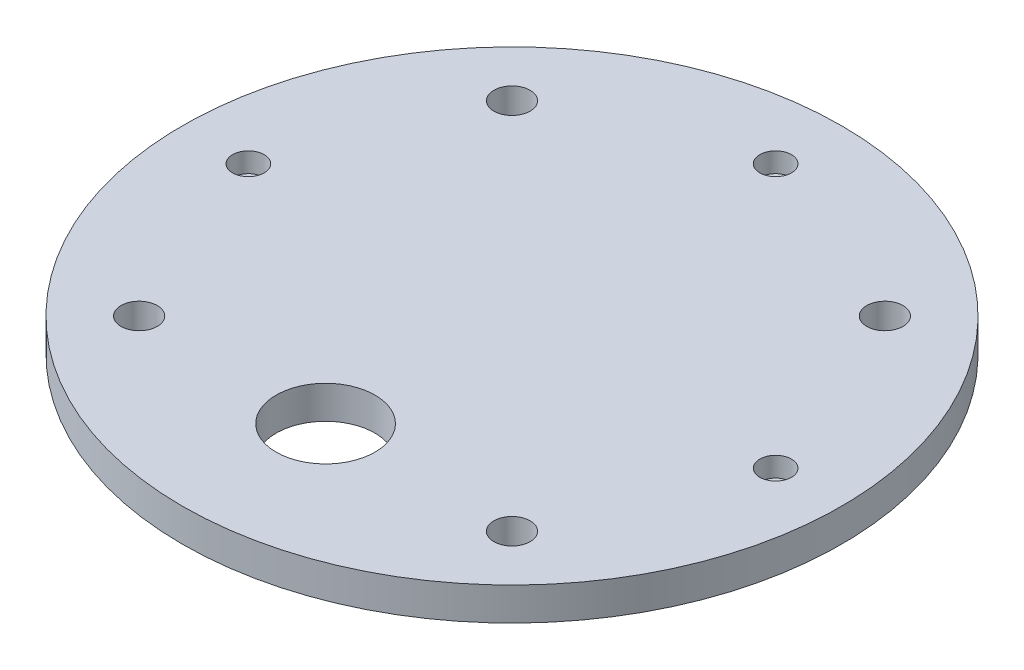
ISO-10303-21;
HEADER;
FILE_DESCRIPTION(('STEP AP214'),'2;1');
FILE_NAME('part.step','',(''),(''),'','','');
FILE_SCHEMA(('AUTOMOTIVE_DESIGN { 1 0 10303 214 1 1 1 1 }'));
ENDSEC;
DATA;
#1=APPLICATION_CONTEXT('core data for automotive mechanical design processes');
#2=APPLICATION_PROTOCOL_DEFINITION('international standard','automotive_design',2000,#1);
#3=PRODUCT_CONTEXT('',#1,'mechanical');
#4=PRODUCT('Part','Part','',(#3));
#5=PRODUCT_RELATED_PRODUCT_CATEGORY('part','',(#4));
#6=PRODUCT_DEFINITION_FORMATION('','',#4);
#7=PRODUCT_DEFINITION_CONTEXT('part definition',#1,'design');
#8=PRODUCT_DEFINITION('design','',#6,#7);
#9=PRODUCT_DEFINITION_SHAPE('','',#8);
#10=(LENGTH_UNIT() NAMED_UNIT(*) SI_UNIT(.MILLI.,.METRE.));
#11=(NAMED_UNIT(*) PLANE_ANGLE_UNIT() SI_UNIT($,.RADIAN.));
#12=(NAMED_UNIT(*) SI_UNIT($,.STERADIAN.) SOLID_ANGLE_UNIT());
#13=UNCERTAINTY_MEASURE_WITH_UNIT(LENGTH_MEASURE(1.E-05),#10,'distance_accuracy_value','');
#14=(GEOMETRIC_REPRESENTATION_CONTEXT(3) GLOBAL_UNCERTAINTY_ASSIGNED_CONTEXT((#13)) GLOBAL_UNIT_ASSIGNED_CONTEXT((#10,
#11,#12)) REPRESENTATION_CONTEXT('',''));
#15=CARTESIAN_POINT('',(0.,0.,0.));
#16=DIRECTION('',(0.,0.,1.));
#17=DIRECTION('',(1.,0.,0.));
#18=AXIS2_PLACEMENT_3D('',#15,#16,#17);
#19=CARTESIAN_POINT('',(0.,-5.,0.));
#20=DIRECTION('',(0.,1.,0.));
#21=DIRECTION('',(0.,0.,1.));
#22=AXIS2_PLACEMENT_3D('',#19,#20,#21);
#23=CYLINDRICAL_SURFACE('',#22,50.);
#24=CARTESIAN_POINT('',(0.,-5.,0.));
#25=DIRECTION('',(0.,1.,0.));
#26=DIRECTION('',(0.,0.,1.));
#27=AXIS2_PLACEMENT_3D('',#24,#25,#26);
#28=CIRCLE('',#27,50.);
#29=CARTESIAN_POINT('',(0.,-5.,50.));
#30=VERTEX_POINT('',#29);
#31=EDGE_CURVE('E10',#30,#30,#28,.T.);
#32=ORIENTED_EDGE('',*,*,#31,.T.);
#33=EDGE_LOOP('',(#32));
#34=FACE_BOUND('',#33,.T.);
#35=CARTESIAN_POINT('',(0.,0.,0.));
#36=DIRECTION('',(0.,1.,0.));
#37=DIRECTION('',(0.,0.,1.));
#38=AXIS2_PLACEMENT_3D('',#35,#36,#37);
#39=CIRCLE('',#38,50.);
#40=CARTESIAN_POINT('',(0.,0.,50.));
#41=VERTEX_POINT('',#40);
#42=EDGE_CURVE('E37',#41,#41,#39,.T.);
#43=ORIENTED_EDGE('',*,*,#42,.F.);
#44=EDGE_LOOP('',(#43));
#45=FACE_BOUND('',#44,.T.);
#46=ADVANCED_FACE('F34',(#34,#45),#23,.T.);
#47=CARTESIAN_POINT('',(0.,-5.,0.));
#48=DIRECTION('',(0.,1.,0.));
#49=DIRECTION('',(0.,0.,1.));
#50=AXIS2_PLACEMENT_3D('',#47,#48,#49);
#51=PLANE('',#50);
#52=CARTESIAN_POINT('',(0.,-5.,28.2842712474616));
#53=DIRECTION('',(0.,1.,0.));
#54=DIRECTION('',(0.,0.,1.));
#55=AXIS2_PLACEMENT_3D('',#52,#53,#54);
#56=CIRCLE('',#55,7.5);
#57=CARTESIAN_POINT('',(0.,-5.,35.7842712474616));
#58=VERTEX_POINT('',#57);
#59=EDGE_CURVE('E65',#58,#58,#56,.T.);
#60=ORIENTED_EDGE('',*,*,#59,.T.);
#61=EDGE_LOOP('',(#60));
#62=FACE_BOUND('',#61,.T.);
#63=CARTESIAN_POINT('',(-28.284271247462,-5.,-28.2842712474604));
#64=DIRECTION('',(0.,1.,0.));
#65=DIRECTION('',(0.,0.,1.));
#66=AXIS2_PLACEMENT_3D('',#63,#64,#65);
#67=CIRCLE('',#66,2.75000000000174);
#68=CARTESIAN_POINT('',(-28.284271247462,-5.,-25.5342712474586));
#69=VERTEX_POINT('',#68);
#70=EDGE_CURVE('E44',#69,#69,#67,.T.);
#71=ORIENTED_EDGE('',*,*,#70,.T.);
#72=EDGE_LOOP('',(#71));
#73=FACE_BOUND('',#72,.T.);
#74=CARTESIAN_POINT('',(-28.2842712474604,-5.,28.2842712474636));
#75=DIRECTION('',(0.,1.,0.));
#76=DIRECTION('',(0.,0.,1.));
#77=AXIS2_PLACEMENT_3D('',#74,#75,#76);
#78=CIRCLE('',#77,2.7500000000012);
#79=CARTESIAN_POINT('',(-28.2842712474604,-5.,31.0342712474648));
#80=VERTEX_POINT('',#79);
#81=EDGE_CURVE('E48',#80,#80,#78,.T.);
#82=ORIENTED_EDGE('',*,*,#81,.T.);
#83=EDGE_LOOP('',(#82));
#84=FACE_BOUND('',#83,.T.);
#85=CARTESIAN_POINT('',(28.2842712474636,-5.,28.284271247462));
#86=DIRECTION('',(0.,1.,0.));
#87=DIRECTION('',(0.,0.,1.));
#88=AXIS2_PLACEMENT_3D('',#85,#86,#87);
#89=CIRCLE('',#88,2.74999999999958);
#90=CARTESIAN_POINT('',(28.2842712474636,-5.,31.0342712474616));
#91=VERTEX_POINT('',#90);
#92=EDGE_CURVE('E51',#91,#91,#89,.T.);
#93=ORIENTED_EDGE('',*,*,#92,.T.);
#94=EDGE_LOOP('',(#93));
#95=FACE_BOUND('',#94,.T.);
#96=CARTESIAN_POINT('',(28.284271247462,-5.,-28.284271247462));
#97=DIRECTION('',(0.,1.,0.));
#98=DIRECTION('',(0.,0.,1.));
#99=AXIS2_PLACEMENT_3D('',#96,#97,#98);
#100=CIRCLE('',#99,2.75);
#101=CARTESIAN_POINT('',(28.284271247462,-5.,-25.534271247462));
#102=VERTEX_POINT('',#101);
#103=EDGE_CURVE('E54',#102,#102,#100,.T.);
#104=ORIENTED_EDGE('',*,*,#103,.T.);
#105=EDGE_LOOP('',(#104));
#106=FACE_BOUND('',#105,.T.);
#107=ORIENTED_EDGE('',*,*,#31,.F.);
#108=EDGE_LOOP('',(#107));
#109=FACE_BOUND('',#108,.T.);
#110=ADVANCED_FACE('F107',(#62,#73,#84,#95,#106,#109),#51,.F.);
#111=CARTESIAN_POINT('',(0.,0.,0.));
#112=DIRECTION('',(0.,1.,0.));
#113=DIRECTION('',(0.,0.,1.));
#114=AXIS2_PLACEMENT_3D('',#111,#112,#113);
#115=PLANE('',#114);
#116=CARTESIAN_POINT('',(0.,0.,-40.));
#117=DIRECTION('',(0.,1.,0.));
#118=DIRECTION('',(0.,0.,1.));
#119=AXIS2_PLACEMENT_3D('',#116,#117,#118);
#120=CIRCLE('',#119,2.4);
#121=CARTESIAN_POINT('',(0.,0.,-37.6));
#122=VERTEX_POINT('',#121);
#123=EDGE_CURVE('E88',#122,#122,#120,.T.);
#124=ORIENTED_EDGE('',*,*,#123,.F.);
#125=EDGE_LOOP('',(#124));
#126=FACE_BOUND('',#125,.T.);
#127=CARTESIAN_POINT('',(40.,0.,-1.7104314940364E-13));
#128=DIRECTION('',(0.,1.,0.));
#129=DIRECTION('',(0.,0.,1.));
#130=AXIS2_PLACEMENT_3D('',#127,#128,#129);
#131=CIRCLE('',#130,2.4);
#132=CARTESIAN_POINT('',(40.,0.,2.39999999999983));
#133=VERTEX_POINT('',#132);
#134=EDGE_CURVE('E85',#133,#133,#131,.T.);
#135=ORIENTED_EDGE('',*,*,#134,.F.);
#136=EDGE_LOOP('',(#135));
#137=FACE_BOUND('',#136,.T.);
#138=CARTESIAN_POINT('',(-40.,0.,0.));
#139=DIRECTION('',(0.,1.,0.));
#140=DIRECTION('',(0.,0.,1.));
#141=AXIS2_PLACEMENT_3D('',#138,#139,#140);
#142=CIRCLE('',#141,2.4);
#143=CARTESIAN_POINT('',(-40.,0.,2.4));
#144=VERTEX_POINT('',#143);
#145=EDGE_CURVE('E79',#144,#144,#142,.T.);
#146=ORIENTED_EDGE('',*,*,#145,.F.);
#147=EDGE_LOOP('',(#146));
#148=FACE_BOUND('',#147,.T.);
#149=CARTESIAN_POINT('',(0.,0.,28.2842712474616));
#150=DIRECTION('',(0.,1.,0.));
#151=DIRECTION('',(0.,0.,1.));
#152=AXIS2_PLACEMENT_3D('',#149,#150,#151);
#153=CIRCLE('',#152,7.5);
#154=CARTESIAN_POINT('',(0.,0.,35.7842712474616));
#155=VERTEX_POINT('',#154);
#156=EDGE_CURVE('E72',#155,#155,#153,.T.);
#157=ORIENTED_EDGE('',*,*,#156,.F.);
#158=EDGE_LOOP('',(#157));
#159=FACE_BOUND('',#158,.T.);
#160=CARTESIAN_POINT('',(-28.284271247462,0.,-28.2842712474604));
#161=DIRECTION('',(0.,1.,0.));
#162=DIRECTION('',(0.,0.,1.));
#163=AXIS2_PLACEMENT_3D('',#160,#161,#162);
#164=CIRCLE('',#163,2.75000000000174);
#165=CARTESIAN_POINT('',(-28.284271247462,0.,-25.5342712474586));
#166=VERTEX_POINT('',#165);
#167=EDGE_CURVE('E61',#166,#166,#164,.T.);
#168=ORIENTED_EDGE('',*,*,#167,.F.);
#169=EDGE_LOOP('',(#168));
#170=FACE_BOUND('',#169,.T.);
#171=CARTESIAN_POINT('',(-28.2842712474604,0.,28.2842712474636));
#172=DIRECTION('',(0.,1.,0.));
#173=DIRECTION('',(0.,0.,1.));
#174=AXIS2_PLACEMENT_3D('',#171,#172,#173);
#175=CIRCLE('',#174,2.7500000000012);
#176=CARTESIAN_POINT('',(-28.2842712474604,0.,31.0342712474648));
#177=VERTEX_POINT('',#176);
#178=EDGE_CURVE('E64',#177,#177,#175,.T.);
#179=ORIENTED_EDGE('',*,*,#178,.F.);
#180=EDGE_LOOP('',(#179));
#181=FACE_BOUND('',#180,.T.);
#182=CARTESIAN_POINT('',(28.2842712474636,0.,28.284271247462));
#183=DIRECTION('',(0.,1.,0.));
#184=DIRECTION('',(0.,0.,1.));
#185=AXIS2_PLACEMENT_3D('',#182,#183,#184);
#186=CIRCLE('',#185,2.74999999999958);
#187=CARTESIAN_POINT('',(28.2842712474636,0.,31.0342712474616));
#188=VERTEX_POINT('',#187);
#189=EDGE_CURVE('E60',#188,#188,#186,.T.);
#190=ORIENTED_EDGE('',*,*,#189,.F.);
#191=EDGE_LOOP('',(#190));
#192=FACE_BOUND('',#191,.T.);
#193=CARTESIAN_POINT('',(28.284271247462,0.,-28.284271247462));
#194=DIRECTION('',(0.,1.,0.));
#195=DIRECTION('',(0.,0.,1.));
#196=AXIS2_PLACEMENT_3D('',#193,#194,#195);
#197=CIRCLE('',#196,2.75);
#198=CARTESIAN_POINT('',(28.284271247462,0.,-25.534271247462));
#199=VERTEX_POINT('',#198);
#200=EDGE_CURVE('E57',#199,#199,#197,.T.);
#201=ORIENTED_EDGE('',*,*,#200,.F.);
#202=EDGE_LOOP('',(#201));
#203=FACE_BOUND('',#202,.T.);
#204=ORIENTED_EDGE('',*,*,#42,.T.);
#205=EDGE_LOOP('',(#204));
#206=FACE_BOUND('',#205,.T.);
#207=ADVANCED_FACE('F103',(#126,#137,#148,#159,#170,#181,#192,#203,#206),#115,.T.);
#208=CARTESIAN_POINT('',(28.284271247462,-24.,-28.284271247462));
#209=DIRECTION('',(0.,1.,0.));
#210=DIRECTION('',(0.,0.,1.));
#211=AXIS2_PLACEMENT_3D('',#208,#209,#210);
#212=CYLINDRICAL_SURFACE('',#211,2.75);
#213=ORIENTED_EDGE('',*,*,#200,.T.);
#214=EDGE_LOOP('',(#213));
#215=FACE_BOUND('',#214,.T.);
#216=ORIENTED_EDGE('',*,*,#103,.F.);
#217=EDGE_LOOP('',(#216));
#218=FACE_BOUND('',#217,.T.);
#219=ADVANCED_FACE('F106',(#215,#218),#212,.F.);
#220=CARTESIAN_POINT('',(28.2842712474636,-24.,28.284271247462));
#221=DIRECTION('',(0.,1.,0.));
#222=DIRECTION('',(0.,0.,1.));
#223=AXIS2_PLACEMENT_3D('',#220,#221,#222);
#224=CYLINDRICAL_SURFACE('',#223,2.74999999999958);
#225=ORIENTED_EDGE('',*,*,#189,.T.);
#226=EDGE_LOOP('',(#225));
#227=FACE_BOUND('',#226,.T.);
#228=ORIENTED_EDGE('',*,*,#92,.F.);
#229=EDGE_LOOP('',(#228));
#230=FACE_BOUND('',#229,.T.);
#231=ADVANCED_FACE('F137',(#227,#230),#224,.F.);
#232=CARTESIAN_POINT('',(-28.2842712474604,-24.,28.2842712474636));
#233=DIRECTION('',(0.,1.,0.));
#234=DIRECTION('',(0.,0.,1.));
#235=AXIS2_PLACEMENT_3D('',#232,#233,#234);
#236=CYLINDRICAL_SURFACE('',#235,2.7500000000012);
#237=ORIENTED_EDGE('',*,*,#178,.T.);
#238=EDGE_LOOP('',(#237));
#239=FACE_BOUND('',#238,.T.);
#240=ORIENTED_EDGE('',*,*,#81,.F.);
#241=EDGE_LOOP('',(#240));
#242=FACE_BOUND('',#241,.T.);
#243=ADVANCED_FACE('F143',(#239,#242),#236,.F.);
#244=CARTESIAN_POINT('',(-28.284271247462,-24.,-28.2842712474604));
#245=DIRECTION('',(0.,1.,0.));
#246=DIRECTION('',(0.,0.,1.));
#247=AXIS2_PLACEMENT_3D('',#244,#245,#246);
#248=CYLINDRICAL_SURFACE('',#247,2.75000000000174);
#249=ORIENTED_EDGE('',*,*,#167,.T.);
#250=EDGE_LOOP('',(#249));
#251=FACE_BOUND('',#250,.T.);
#252=ORIENTED_EDGE('',*,*,#70,.F.);
#253=EDGE_LOOP('',(#252));
#254=FACE_BOUND('',#253,.T.);
#255=ADVANCED_FACE('F139',(#251,#254),#248,.F.);
#256=CARTESIAN_POINT('',(0.,-24.,28.2842712474616));
#257=DIRECTION('',(0.,1.,0.));
#258=DIRECTION('',(0.,0.,1.));
#259=AXIS2_PLACEMENT_3D('',#256,#257,#258);
#260=CYLINDRICAL_SURFACE('',#259,7.5);
#261=ORIENTED_EDGE('',*,*,#156,.T.);
#262=EDGE_LOOP('',(#261));
#263=FACE_BOUND('',#262,.T.);
#264=ORIENTED_EDGE('',*,*,#59,.F.);
#265=EDGE_LOOP('',(#264));
#266=FACE_BOUND('',#265,.T.);
#267=ADVANCED_FACE('F142',(#263,#266),#260,.F.);
#268=CARTESIAN_POINT('',(-40.,-3.,0.));
#269=DIRECTION('',(0.,1.,0.));
#270=DIRECTION('',(0.,0.,1.));
#271=AXIS2_PLACEMENT_3D('',#268,#269,#270);
#272=CYLINDRICAL_SURFACE('',#271,2.4);
#273=CARTESIAN_POINT('',(-40.,-3.,0.));
#274=DIRECTION('',(0.,1.,0.));
#275=DIRECTION('',(0.,0.,1.));
#276=AXIS2_PLACEMENT_3D('',#273,#274,#275);
#277=CIRCLE('',#276,2.4);
#278=CARTESIAN_POINT('',(-40.,-3.,2.4));
#279=VERTEX_POINT('',#278);
#280=EDGE_CURVE('E76',#279,#279,#277,.T.);
#281=ORIENTED_EDGE('',*,*,#280,.F.);
#282=EDGE_LOOP('',(#281));
#283=FACE_BOUND('',#282,.T.);
#284=ORIENTED_EDGE('',*,*,#145,.T.);
#285=EDGE_LOOP('',(#284));
#286=FACE_BOUND('',#285,.T.);
#287=ADVANCED_FACE('F153',(#283,#286),#272,.F.);
#288=CARTESIAN_POINT('',(-40.,-3.,0.));
#289=DIRECTION('',(0.,1.,0.));
#290=DIRECTION('',(0.,0.,1.));
#291=AXIS2_PLACEMENT_3D('',#288,#289,#290);
#292=PLANE('',#291);
#293=ORIENTED_EDGE('',*,*,#280,.T.);
#294=EDGE_LOOP('',(#293));
#295=FACE_BOUND('',#294,.T.);
#296=ADVANCED_FACE('F155',(#295),#292,.T.);
#297=CARTESIAN_POINT('',(40.,-3.,-1.7104314940364E-13));
#298=DIRECTION('',(0.,1.,0.));
#299=DIRECTION('',(0.,0.,1.));
#300=AXIS2_PLACEMENT_3D('',#297,#298,#299);
#301=CYLINDRICAL_SURFACE('',#300,2.4);
#302=CARTESIAN_POINT('',(40.,-3.,-1.7104314940364E-13));
#303=DIRECTION('',(0.,1.,0.));
#304=DIRECTION('',(0.,0.,1.));
#305=AXIS2_PLACEMENT_3D('',#302,#303,#304);
#306=CIRCLE('',#305,2.4);
#307=CARTESIAN_POINT('',(40.,-3.,2.39999999999983));
#308=VERTEX_POINT('',#307);
#309=EDGE_CURVE('E82',#308,#308,#306,.T.);
#310=ORIENTED_EDGE('',*,*,#309,.F.);
#311=EDGE_LOOP('',(#310));
#312=FACE_BOUND('',#311,.T.);
#313=ORIENTED_EDGE('',*,*,#134,.T.);
#314=EDGE_LOOP('',(#313));
#315=FACE_BOUND('',#314,.T.);
#316=ADVANCED_FACE('F158',(#312,#315),#301,.F.);
#317=CARTESIAN_POINT('',(40.,-3.,-1.7104314940364E-13));
#318=DIRECTION('',(0.,1.,0.));
#319=DIRECTION('',(0.,0.,1.));
#320=AXIS2_PLACEMENT_3D('',#317,#318,#319);
#321=PLANE('',#320);
#322=ORIENTED_EDGE('',*,*,#309,.T.);
#323=EDGE_LOOP('',(#322));
#324=FACE_BOUND('',#323,.T.);
#325=ADVANCED_FACE('F99',(#324),#321,.T.);
#326=CARTESIAN_POINT('',(0.,-3.,-40.));
#327=DIRECTION('',(0.,1.,0.));
#328=DIRECTION('',(0.,0.,1.));
#329=AXIS2_PLACEMENT_3D('',#326,#327,#328);
#330=CYLINDRICAL_SURFACE('',#329,2.4);
#331=CARTESIAN_POINT('',(0.,-3.,-40.));
#332=DIRECTION('',(0.,1.,0.));
#333=DIRECTION('',(0.,0.,1.));
#334=AXIS2_PLACEMENT_3D('',#331,#332,#333);
#335=CIRCLE('',#334,2.4);
#336=CARTESIAN_POINT('',(0.,-3.,-37.6));
#337=VERTEX_POINT('',#336);
#338=EDGE_CURVE('E75',#337,#337,#335,.T.);
#339=ORIENTED_EDGE('',*,*,#338,.F.);
#340=EDGE_LOOP('',(#339));
#341=FACE_BOUND('',#340,.T.);
#342=ORIENTED_EDGE('',*,*,#123,.T.);
#343=EDGE_LOOP('',(#342));
#344=FACE_BOUND('',#343,.T.);
#345=ADVANCED_FACE('F96',(#341,#344),#330,.F.);
#346=CARTESIAN_POINT('',(0.,-3.,-40.));
#347=DIRECTION('',(0.,1.,0.));
#348=DIRECTION('',(0.,0.,1.));
#349=AXIS2_PLACEMENT_3D('',#346,#347,#348);
#350=PLANE('',#349);
#351=ORIENTED_EDGE('',*,*,#338,.T.);
#352=EDGE_LOOP('',(#351));
#353=FACE_BOUND('',#352,.T.);
#354=ADVANCED_FACE('F94',(#353),#350,.T.);
#355=CLOSED_SHELL('',(#46,#110,#207,#219,#231,#243,#255,#267,#287,#296,#316,#325,#345,#354));
#356=MANIFOLD_SOLID_BREP('B2',#355);
#357=ADVANCED_BREP_SHAPE_REPRESENTATION('',(#18,#356),#14);
#358=SHAPE_DEFINITION_REPRESENTATION(#9,#357);
ENDSEC;
END-ISO-10303-21;
